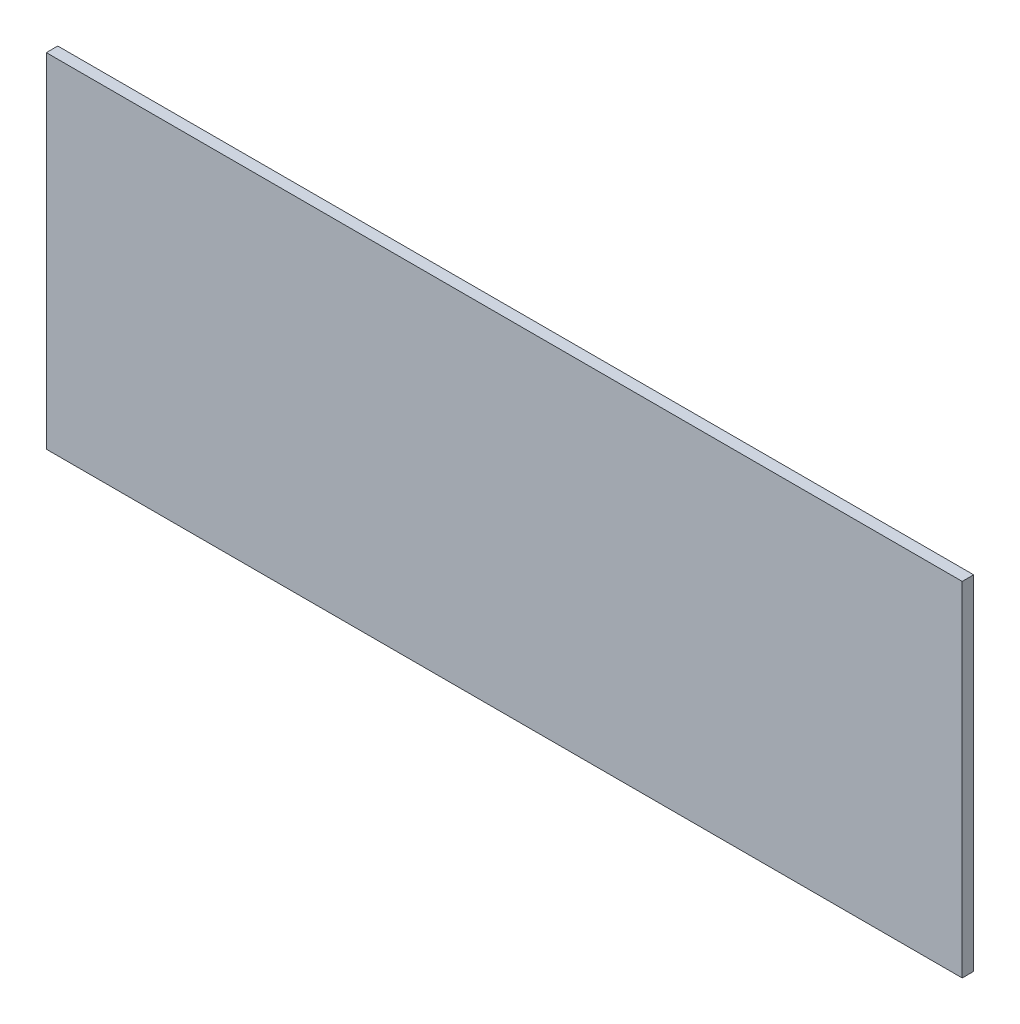
ISO-10303-21;
HEADER;
FILE_DESCRIPTION(('STEP AP214'),'2;1');
FILE_NAME('part.step','',(''),(''),'','','');
FILE_SCHEMA(('AUTOMOTIVE_DESIGN { 1 0 10303 214 1 1 1 1 }'));
ENDSEC;
DATA;
#1=APPLICATION_CONTEXT('core data for automotive mechanical design processes');
#2=APPLICATION_PROTOCOL_DEFINITION('international standard','automotive_design',2000,#1);
#3=PRODUCT_CONTEXT('',#1,'mechanical');
#4=PRODUCT('Part','Part','',(#3));
#5=PRODUCT_RELATED_PRODUCT_CATEGORY('part','',(#4));
#6=PRODUCT_DEFINITION_FORMATION('','',#4);
#7=PRODUCT_DEFINITION_CONTEXT('part definition',#1,'design');
#8=PRODUCT_DEFINITION('design','',#6,#7);
#9=PRODUCT_DEFINITION_SHAPE('','',#8);
#10=(LENGTH_UNIT() NAMED_UNIT(*) SI_UNIT(.MILLI.,.METRE.));
#11=(NAMED_UNIT(*) PLANE_ANGLE_UNIT() SI_UNIT($,.RADIAN.));
#12=(NAMED_UNIT(*) SI_UNIT($,.STERADIAN.) SOLID_ANGLE_UNIT());
#13=UNCERTAINTY_MEASURE_WITH_UNIT(LENGTH_MEASURE(1.E-05),#10,'distance_accuracy_value','');
#14=(GEOMETRIC_REPRESENTATION_CONTEXT(3) GLOBAL_UNCERTAINTY_ASSIGNED_CONTEXT((#13)) GLOBAL_UNIT_ASSIGNED_CONTEXT((#10,
#11,#12)) REPRESENTATION_CONTEXT('',''));
#15=CARTESIAN_POINT('',(0.,0.,0.));
#16=DIRECTION('',(0.,0.,1.));
#17=DIRECTION('',(1.,0.,0.));
#18=AXIS2_PLACEMENT_3D('',#15,#16,#17);
#19=CARTESIAN_POINT('',(0.,0.,1.));
#20=DIRECTION('',(-1.,0.,0.));
#21=DIRECTION('',(0.,0.,1.));
#22=AXIS2_PLACEMENT_3D('',#19,#20,#21);
#23=PLANE('',#22);
#24=DIRECTION('',(0.,1.,0.));
#25=VECTOR('',#24,1.);
#26=CARTESIAN_POINT('',(0.,0.,0.));
#27=LINE('',#26,#25);
#28=CARTESIAN_POINT('',(0.,0.,0.));
#29=VERTEX_POINT('',#28);
#30=CARTESIAN_POINT('',(0.,30.,0.));
#31=VERTEX_POINT('',#30);
#32=EDGE_CURVE('E96',#29,#31,#27,.T.);
#33=ORIENTED_EDGE('',*,*,#32,.T.);
#34=DIRECTION('',(0.,0.,-1.));
#35=VECTOR('',#34,1.);
#36=CARTESIAN_POINT('',(0.,30.,1.));
#37=LINE('',#36,#35);
#38=CARTESIAN_POINT('',(0.,30.,1.));
#39=VERTEX_POINT('',#38);
#40=EDGE_CURVE('E11',#39,#31,#37,.T.);
#41=ORIENTED_EDGE('',*,*,#40,.F.);
#42=DIRECTION('',(0.,1.,0.));
#43=VECTOR('',#42,1.);
#44=CARTESIAN_POINT('',(0.,0.,1.));
#45=LINE('',#44,#43);
#46=CARTESIAN_POINT('',(0.,0.,1.));
#47=VERTEX_POINT('',#46);
#48=EDGE_CURVE('E84',#47,#39,#45,.T.);
#49=ORIENTED_EDGE('',*,*,#48,.F.);
#50=DIRECTION('',(0.,0.,-1.));
#51=VECTOR('',#50,1.);
#52=CARTESIAN_POINT('',(0.,0.,1.));
#53=LINE('',#52,#51);
#54=EDGE_CURVE('E92',#47,#29,#53,.T.);
#55=ORIENTED_EDGE('',*,*,#54,.T.);
#56=EDGE_LOOP('',(#33,#41,#49,#55));
#57=FACE_BOUND('',#56,.T.);
#58=ADVANCED_FACE('F33',(#57),#23,.F.);
#59=CARTESIAN_POINT('',(0.,30.,1.));
#60=DIRECTION('',(0.,-1.,0.));
#61=DIRECTION('',(1.,0.,0.));
#62=AXIS2_PLACEMENT_3D('',#59,#60,#61);
#63=PLANE('',#62);
#64=DIRECTION('',(-1.,0.,0.));
#65=VECTOR('',#64,1.);
#66=CARTESIAN_POINT('',(0.,30.,0.));
#67=LINE('',#66,#65);
#68=CARTESIAN_POINT('',(-80.,30.,0.));
#69=VERTEX_POINT('',#68);
#70=EDGE_CURVE('E88',#31,#69,#67,.T.);
#71=ORIENTED_EDGE('',*,*,#70,.T.);
#72=DIRECTION('',(0.,0.,-1.));
#73=VECTOR('',#72,1.);
#74=CARTESIAN_POINT('',(-80.,30.,1.));
#75=LINE('',#74,#73);
#76=CARTESIAN_POINT('',(-80.,30.,1.));
#77=VERTEX_POINT('',#76);
#78=EDGE_CURVE('E41',#77,#69,#75,.T.);
#79=ORIENTED_EDGE('',*,*,#78,.F.);
#80=DIRECTION('',(-1.,0.,0.));
#81=VECTOR('',#80,1.);
#82=CARTESIAN_POINT('',(0.,30.,1.));
#83=LINE('',#82,#81);
#84=EDGE_CURVE('E79',#39,#77,#83,.T.);
#85=ORIENTED_EDGE('',*,*,#84,.F.);
#86=ORIENTED_EDGE('',*,*,#40,.T.);
#87=EDGE_LOOP('',(#71,#79,#85,#86));
#88=FACE_BOUND('',#87,.T.);
#89=ADVANCED_FACE('F87',(#88),#63,.F.);
#90=CARTESIAN_POINT('',(-80.,0.,1.));
#91=DIRECTION('',(1.,0.,0.));
#92=DIRECTION('',(0.,0.,-1.));
#93=AXIS2_PLACEMENT_3D('',#90,#91,#92);
#94=PLANE('',#93);
#95=DIRECTION('',(0.,-1.,0.));
#96=VECTOR('',#95,1.);
#97=CARTESIAN_POINT('',(-80.,0.,0.));
#98=LINE('',#97,#96);
#99=CARTESIAN_POINT('',(-80.,0.,0.));
#100=VERTEX_POINT('',#99);
#101=EDGE_CURVE('E66',#69,#100,#98,.T.);
#102=ORIENTED_EDGE('',*,*,#101,.T.);
#103=DIRECTION('',(0.,0.,-1.));
#104=VECTOR('',#103,1.);
#105=CARTESIAN_POINT('',(-80.,0.,1.));
#106=LINE('',#105,#104);
#107=CARTESIAN_POINT('',(-80.,0.,1.));
#108=VERTEX_POINT('',#107);
#109=EDGE_CURVE('E89',#108,#100,#106,.T.);
#110=ORIENTED_EDGE('',*,*,#109,.F.);
#111=DIRECTION('',(0.,-1.,0.));
#112=VECTOR('',#111,1.);
#113=CARTESIAN_POINT('',(-80.,0.,1.));
#114=LINE('',#113,#112);
#115=EDGE_CURVE('E82',#77,#108,#114,.T.);
#116=ORIENTED_EDGE('',*,*,#115,.F.);
#117=ORIENTED_EDGE('',*,*,#78,.T.);
#118=EDGE_LOOP('',(#102,#110,#116,#117));
#119=FACE_BOUND('',#118,.T.);
#120=ADVANCED_FACE('F90',(#119),#94,.F.);
#121=CARTESIAN_POINT('',(0.,0.,1.));
#122=DIRECTION('',(0.,1.,0.));
#123=DIRECTION('',(0.,0.,1.));
#124=AXIS2_PLACEMENT_3D('',#121,#122,#123);
#125=PLANE('',#124);
#126=DIRECTION('',(1.,0.,0.));
#127=VECTOR('',#126,1.);
#128=CARTESIAN_POINT('',(0.,0.,0.));
#129=LINE('',#128,#127);
#130=EDGE_CURVE('E72',#100,#29,#129,.T.);
#131=ORIENTED_EDGE('',*,*,#130,.T.);
#132=ORIENTED_EDGE('',*,*,#54,.F.);
#133=DIRECTION('',(1.,0.,0.));
#134=VECTOR('',#133,1.);
#135=CARTESIAN_POINT('',(0.,0.,1.));
#136=LINE('',#135,#134);
#137=EDGE_CURVE('E49',#108,#47,#136,.T.);
#138=ORIENTED_EDGE('',*,*,#137,.F.);
#139=ORIENTED_EDGE('',*,*,#109,.T.);
#140=EDGE_LOOP('',(#131,#132,#138,#139));
#141=FACE_BOUND('',#140,.T.);
#142=ADVANCED_FACE('F103',(#141),#125,.F.);
#143=CARTESIAN_POINT('',(0.,0.,1.));
#144=DIRECTION('',(0.,0.,1.));
#145=DIRECTION('',(1.,0.,0.));
#146=AXIS2_PLACEMENT_3D('',#143,#144,#145);
#147=PLANE('',#146);
#148=ORIENTED_EDGE('',*,*,#48,.T.);
#149=ORIENTED_EDGE('',*,*,#84,.T.);
#150=ORIENTED_EDGE('',*,*,#115,.T.);
#151=ORIENTED_EDGE('',*,*,#137,.T.);
#152=EDGE_LOOP('',(#148,#149,#150,#151));
#153=FACE_BOUND('',#152,.T.);
#154=ADVANCED_FACE('F80',(#153),#147,.T.);
#155=CARTESIAN_POINT('',(0.,0.,0.));
#156=DIRECTION('',(0.,0.,1.));
#157=DIRECTION('',(1.,0.,0.));
#158=AXIS2_PLACEMENT_3D('',#155,#156,#157);
#159=PLANE('',#158);
#160=ORIENTED_EDGE('',*,*,#32,.F.);
#161=ORIENTED_EDGE('',*,*,#130,.F.);
#162=ORIENTED_EDGE('',*,*,#101,.F.);
#163=ORIENTED_EDGE('',*,*,#70,.F.);
#164=EDGE_LOOP('',(#160,#161,#162,#163));
#165=FACE_BOUND('',#164,.T.);
#166=ADVANCED_FACE('F106',(#165),#159,.F.);
#167=CLOSED_SHELL('',(#58,#89,#120,#142,#154,#166));
#168=MANIFOLD_SOLID_BREP('B2',#167);
#169=ADVANCED_BREP_SHAPE_REPRESENTATION('',(#18,#168),#14);
#170=SHAPE_DEFINITION_REPRESENTATION(#9,#169);
ENDSEC;
END-ISO-10303-21;
